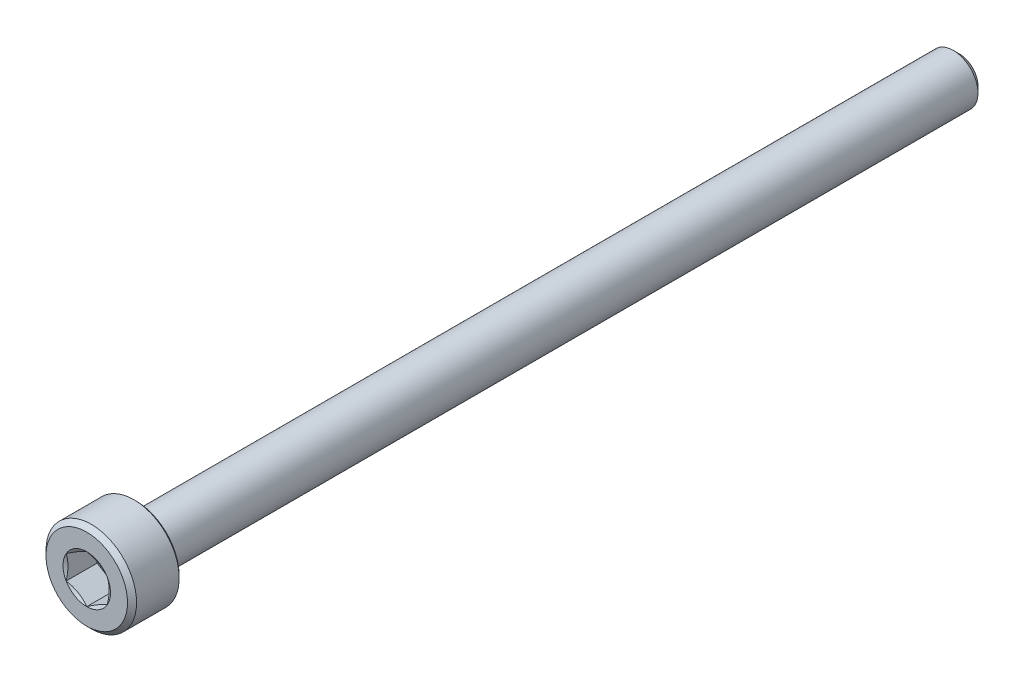
ISO-10303-21;
HEADER;
FILE_DESCRIPTION(('STEP AP214'),'2;1');
FILE_NAME('part.step','',(''),(''),'','','');
FILE_SCHEMA(('AUTOMOTIVE_DESIGN { 1 0 10303 214 1 1 1 1 }'));
ENDSEC;
DATA;
#1=APPLICATION_CONTEXT('core data for automotive mechanical design processes');
#2=APPLICATION_PROTOCOL_DEFINITION('international standard','automotive_design',2000,#1);
#3=PRODUCT_CONTEXT('',#1,'mechanical');
#4=PRODUCT('Part','Part','',(#3));
#5=PRODUCT_RELATED_PRODUCT_CATEGORY('part','',(#4));
#6=PRODUCT_DEFINITION_FORMATION('','',#4);
#7=PRODUCT_DEFINITION_CONTEXT('part definition',#1,'design');
#8=PRODUCT_DEFINITION('design','',#6,#7);
#9=PRODUCT_DEFINITION_SHAPE('','',#8);
#10=(LENGTH_UNIT() NAMED_UNIT(*) SI_UNIT(.MILLI.,.METRE.));
#11=(NAMED_UNIT(*) PLANE_ANGLE_UNIT() SI_UNIT($,.RADIAN.));
#12=(NAMED_UNIT(*) SI_UNIT($,.STERADIAN.) SOLID_ANGLE_UNIT());
#13=UNCERTAINTY_MEASURE_WITH_UNIT(LENGTH_MEASURE(1.E-05),#10,'distance_accuracy_value','');
#14=(GEOMETRIC_REPRESENTATION_CONTEXT(3) GLOBAL_UNCERTAINTY_ASSIGNED_CONTEXT((#13)) GLOBAL_UNIT_ASSIGNED_CONTEXT((#10,
#11,#12)) REPRESENTATION_CONTEXT('',''));
#15=CARTESIAN_POINT('',(0.,0.,0.));
#16=DIRECTION('',(0.,0.,1.));
#17=DIRECTION('',(1.,0.,0.));
#18=AXIS2_PLACEMENT_3D('',#15,#16,#17);
#19=CARTESIAN_POINT('',(-2.6125,0.,23.5));
#20=DIRECTION('',(0.,0.,-1.));
#21=DIRECTION('',(-1.,0.,0.));
#22=AXIS2_PLACEMENT_3D('',#19,#20,#21);
#23=PLANE('',#22);
#24=CARTESIAN_POINT('',(0.,0.,23.5));
#25=DIRECTION('',(0.,0.,-1.));
#26=DIRECTION('',(-1.,0.,0.));
#27=AXIS2_PLACEMENT_3D('',#24,#25,#26);
#28=CIRCLE('',#27,1.5);
#29=CARTESIAN_POINT('',(-1.5,0.,23.5));
#30=VERTEX_POINT('',#29);
#31=EDGE_CURVE('E12',#30,#30,#28,.T.);
#32=ORIENTED_EDGE('',*,*,#31,.F.);
#33=EDGE_LOOP('',(#32));
#34=FACE_BOUND('',#33,.T.);
#35=CARTESIAN_POINT('',(0.,0.,23.5));
#36=DIRECTION('',(0.,0.,-1.));
#37=DIRECTION('',(-1.,0.,0.));
#38=AXIS2_PLACEMENT_3D('',#35,#36,#37);
#39=CIRCLE('',#38,2.6125);
#40=CARTESIAN_POINT('',(-2.6125,0.,23.5));
#41=VERTEX_POINT('',#40);
#42=EDGE_CURVE('E260',#41,#41,#39,.T.);
#43=ORIENTED_EDGE('',*,*,#42,.T.);
#44=EDGE_LOOP('',(#43));
#45=FACE_BOUND('',#44,.T.);
#46=ADVANCED_FACE('F42',(#34,#45),#23,.T.);
#47=CARTESIAN_POINT('',(0.,0.,24.625));
#48=DIRECTION('',(0.,0.,1.));
#49=DIRECTION('',(1.,0.,0.));
#50=AXIS2_PLACEMENT_3D('',#47,#48,#49);
#51=PLANE('',#50);
#52=DIRECTION('',(-0.866025403784439,0.5,0.));
#53=VECTOR('',#52,1.);
#54=CARTESIAN_POINT('',(1.25,0.721687836487031,24.625));
#55=LINE('',#54,#53);
#56=CARTESIAN_POINT('',(1.25,0.721687836487031,24.625));
#57=VERTEX_POINT('',#56);
#58=CARTESIAN_POINT('',(0.,1.44337567297406,24.625));
#59=VERTEX_POINT('',#58);
#60=EDGE_CURVE('E108',#57,#59,#55,.T.);
#61=ORIENTED_EDGE('',*,*,#60,.T.);
#62=DIRECTION('',(-0.866025403784438,-0.5,0.));
#63=VECTOR('',#62,1.);
#64=CARTESIAN_POINT('',(0.,1.44337567297406,24.625));
#65=LINE('',#64,#63);
#66=CARTESIAN_POINT('',(-1.25,0.72168783648703,24.625));
#67=VERTEX_POINT('',#66);
#68=EDGE_CURVE('E227',#59,#67,#65,.T.);
#69=ORIENTED_EDGE('',*,*,#68,.T.);
#70=DIRECTION('',(0.,-1.,0.));
#71=VECTOR('',#70,1.);
#72=CARTESIAN_POINT('',(-1.25,0.72168783648703,24.625));
#73=LINE('',#72,#71);
#74=CARTESIAN_POINT('',(-1.25,-0.721687836487034,24.625));
#75=VERTEX_POINT('',#74);
#76=EDGE_CURVE('E230',#67,#75,#73,.T.);
#77=ORIENTED_EDGE('',*,*,#76,.T.);
#78=DIRECTION('',(0.866025403784439,-0.5,0.));
#79=VECTOR('',#78,1.);
#80=CARTESIAN_POINT('',(-1.25,-0.721687836487034,24.625));
#81=LINE('',#80,#79);
#82=CARTESIAN_POINT('',(0.,-1.44337567297407,24.625));
#83=VERTEX_POINT('',#82);
#84=EDGE_CURVE('E231',#75,#83,#81,.T.);
#85=ORIENTED_EDGE('',*,*,#84,.T.);
#86=DIRECTION('',(0.866025403784439,0.5,0.));
#87=VECTOR('',#86,1.);
#88=CARTESIAN_POINT('',(0.,-1.44337567297407,24.625));
#89=LINE('',#88,#87);
#90=CARTESIAN_POINT('',(1.25,-0.721687836487034,24.625));
#91=VERTEX_POINT('',#90);
#92=EDGE_CURVE('E236',#83,#91,#89,.T.);
#93=ORIENTED_EDGE('',*,*,#92,.T.);
#94=DIRECTION('',(0.,1.,0.));
#95=VECTOR('',#94,1.);
#96=CARTESIAN_POINT('',(1.25,-0.721687836487034,24.625));
#97=LINE('',#96,#95);
#98=EDGE_CURVE('E229',#91,#57,#97,.T.);
#99=ORIENTED_EDGE('',*,*,#98,.T.);
#100=EDGE_LOOP('',(#61,#69,#77,#85,#93,#99));
#101=FACE_BOUND('',#100,.T.);
#102=ADVANCED_FACE('F216',(#101),#51,.T.);
#103=CARTESIAN_POINT('',(0.,1.44337567297406,24.625));
#104=DIRECTION('',(-0.5,0.866025403784438,0.));
#105=DIRECTION('',(-0.866025403784439,-0.5,0.));
#106=AXIS2_PLACEMENT_3D('',#103,#104,#105);
#107=PLANE('',#106);
#108=DIRECTION('',(0.,0.,1.));
#109=VECTOR('',#108,1.);
#110=CARTESIAN_POINT('',(0.,1.44337567297406,24.625));
#111=LINE('',#110,#109);
#112=CARTESIAN_POINT('',(0.,1.44337567297406,26.5));
#113=VERTEX_POINT('',#112);
#114=EDGE_CURVE('E64',#59,#113,#111,.T.);
#115=ORIENTED_EDGE('',*,*,#114,.T.);
#116=CARTESIAN_POINT('',(0.000199999999999545,1.4434911430279,26.500066674666));
#117=CARTESIAN_POINT('',(-0.0547333052317655,1.41177538446486,26.4817459147637));
#118=CARTESIAN_POINT('',(-0.11014078650024,1.37978586023939,26.4650833062006));
#119=CARTESIAN_POINT('',(-0.22191536760034,1.31525277575269,26.4359973039458));
#120=CARTESIAN_POINT('',(-0.278284454841711,1.28270806805991,26.4235842019761));
#121=CARTESIAN_POINT('',(-0.390323974086985,1.21802202146378,26.404259687636));
#122=CARTESIAN_POINT('',(-0.44597715845923,1.1858906404852,26.3972196894474));
#123=CARTESIAN_POINT('',(-0.557545653908392,1.12147653960455,26.3888124326306));
#124=CARTESIAN_POINT('',(-0.613460558937601,1.08919405413422,26.3874382152047));
#125=CARTESIAN_POINT('',(-0.717957921181725,1.02886247391297,26.3902833373679));
#126=CARTESIAN_POINT('',(-0.766555949881316,1.00080438896118,26.39380409882));
#127=CARTESIAN_POINT('',(-0.863435362173239,0.944871034195501,26.4049671126993));
#128=CARTESIAN_POINT('',(-0.911716410192164,0.916995958125017,26.4126131855727));
#129=CARTESIAN_POINT('',(-1.00879588385404,0.860947097873544,26.4317294547005));
#130=CARTESIAN_POINT('',(-1.0575820103519,0.832780414607287,26.4432807569797));
#131=CARTESIAN_POINT('',(-1.1544262522921,0.776867365453646,26.4694983146939));
#132=CARTESIAN_POINT('',(-1.20248561032696,0.749120282155138,26.4841584021391));
#133=CARTESIAN_POINT('',(-1.2502,0.721572366433192,26.500066674666));
#134=B_SPLINE_CURVE_WITH_KNOTS('',3,(#116,#117,#118,#119,#120,#121,#122,#123,#124,#125,#126,
#127,#128,#129,#130,#131,#132,#133),.UNSPECIFIED.,.F.,.F.,(4,2,2,2,2,2,2,2,4),(0.,
0.198150821029559,0.396778196315221,0.5904886173544,0.783961049317182,0.952480056398646,
1.1211553973001,1.2935743034359,1.4656542697693),.UNSPECIFIED.);
#135=CARTESIAN_POINT('',(-1.25,0.721687836487032,26.5));
#136=VERTEX_POINT('',#135);
#137=EDGE_CURVE('E121',#113,#136,#134,.T.);
#138=ORIENTED_EDGE('',*,*,#137,.T.);
#139=DIRECTION('',(0.,0.,1.));
#140=VECTOR('',#139,1.);
#141=CARTESIAN_POINT('',(-1.25,0.72168783648703,24.625));
#142=LINE('',#141,#140);
#143=EDGE_CURVE('E245',#67,#136,#142,.T.);
#144=ORIENTED_EDGE('',*,*,#143,.F.);
#145=ORIENTED_EDGE('',*,*,#68,.F.);
#146=EDGE_LOOP('',(#115,#138,#144,#145));
#147=FACE_BOUND('',#146,.T.);
#148=ADVANCED_FACE('F155',(#147),#107,.F.);
#149=CARTESIAN_POINT('',(-1.25,0.72168783648703,24.625));
#150=DIRECTION('',(-1.,0.,0.));
#151=DIRECTION('',(0.,-1.,0.));
#152=AXIS2_PLACEMENT_3D('',#149,#150,#151);
#153=PLANE('',#152);
#154=ORIENTED_EDGE('',*,*,#143,.T.);
#155=CARTESIAN_POINT('',(-1.25,-1.86893140179217,26.9647941109243));
#156=CARTESIAN_POINT('',(-1.25,-1.81495202267025,26.9388968384665));
#157=CARTESIAN_POINT('',(-1.25,-1.76084125344196,26.9132686219312));
#158=CARTESIAN_POINT('',(-1.25,-1.65228662652066,26.8627027606134));
#159=CARTESIAN_POINT('',(-1.25,-1.59784271100767,26.8377652401103));
#160=CARTESIAN_POINT('',(-1.25,-1.48823931692675,26.7885939163498));
#161=CARTESIAN_POINT('',(-1.25,-1.43307750108907,26.7643652994868));
#162=CARTESIAN_POINT('',(-1.25,-1.32229188443621,26.7169950705039));
#163=CARTESIAN_POINT('',(-1.25,-1.26666810781962,26.6938534018645));
#164=CARTESIAN_POINT('',(-1.25,-1.15340083047608,26.6483546130678));
#165=CARTESIAN_POINT('',(-1.25,-1.09574254265115,26.6260338154653));
#166=CARTESIAN_POINT('',(-1.25,-0.979741082890175,26.583255476912));
#167=CARTESIAN_POINT('',(-1.25,-0.921397826164638,26.5627981694397));
#168=CARTESIAN_POINT('',(-1.25,-0.745435524772241,26.5050842376762));
#169=CARTESIAN_POINT('',(-1.25,-0.62656193813286,26.4713502149769));
#170=CARTESIAN_POINT('',(-1.25,-0.445873083681239,26.4322204068282));
#171=CARTESIAN_POINT('',(-1.25,-0.385304700192768,26.4210940606189));
#172=CARTESIAN_POINT('',(-1.25,-0.26348659206503,26.4034278522676));
#173=CARTESIAN_POINT('',(-1.25,-0.202236913753247,26.3968876801832));
#174=CARTESIAN_POINT('',(-1.25,-0.0801324468775848,26.3889987810428));
#175=CARTESIAN_POINT('',(-1.25,-0.0192817197887167,26.3875887912582));
#176=CARTESIAN_POINT('',(-1.25,0.102319232701152,26.3899161878862));
#177=CARTESIAN_POINT('',(-1.25,0.163069451645859,26.393653893026));
#178=CARTESIAN_POINT('',(-1.25,0.312961598922923,26.4088980280361));
#179=CARTESIAN_POINT('',(-1.25,0.401813055628259,26.4232612484297));
#180=CARTESIAN_POINT('',(-1.25,0.577788146583198,26.4602998495149));
#181=CARTESIAN_POINT('',(-1.25,0.664909564430747,26.4829852483542));
#182=CARTESIAN_POINT('',(-1.25,0.795209224728791,26.5217374532821));
#183=CARTESIAN_POINT('',(-1.25,0.839061001813533,26.5356229448103));
#184=CARTESIAN_POINT('',(-1.25,0.926308087473953,26.5646784153621));
#185=CARTESIAN_POINT('',(-1.25,0.969703662172459,26.5798475927664));
#186=CARTESIAN_POINT('',(-1.25,1.05609633508794,26.6112501339966));
#187=CARTESIAN_POINT('',(-1.25,1.09909350410933,26.627483304423));
#188=CARTESIAN_POINT('',(-1.25,1.18474903910479,26.6608382439108));
#189=CARTESIAN_POINT('',(-1.25,1.22740734642399,26.6779601631043));
#190=CARTESIAN_POINT('',(-1.25,1.33629459550825,26.7227614292321));
#191=CARTESIAN_POINT('',(-1.25,1.40230581092028,26.7509693835735));
#192=CARTESIAN_POINT('',(-1.25,1.53373213594212,26.8087450811585));
#193=CARTESIAN_POINT('',(-1.25,1.59914720045374,26.8383129262699));
#194=CARTESIAN_POINT('',(-1.25,1.79469680395942,26.9285769200244));
#195=CARTESIAN_POINT('',(-1.25,1.92411390982368,26.9908242731852));
#196=CARTESIAN_POINT('',(-1.25,2.18184246876936,27.1179296229027));
#197=CARTESIAN_POINT('',(-1.25,2.31015236703661,27.182790734765));
#198=CARTESIAN_POINT('',(-1.25,2.56589305685455,27.3141807455314));
#199=CARTESIAN_POINT('',(-1.25,2.69332395754888,27.3807094324427));
#200=CARTESIAN_POINT('',(-1.25,2.93557826301822,27.5085820016458));
#201=CARTESIAN_POINT('',(-1.25,3.05045639113076,27.5698225704122));
#202=CARTESIAN_POINT('',(-1.25,3.27984311898855,27.6930014800409));
#203=CARTESIAN_POINT('',(-1.25,3.39435170485538,27.7549398467261));
#204=CARTESIAN_POINT('',(-1.25,3.62279327872168,27.8791811560561));
#205=CARTESIAN_POINT('',(-1.25,3.73672698995313,27.941482770676));
#206=CARTESIAN_POINT('',(-1.25,3.96436406629495,28.0664914919315));
#207=CARTESIAN_POINT('',(-1.25,4.07806744314788,28.1291985771761));
#208=CARTESIAN_POINT('',(-1.25,4.19168806612954,28.1920543493623));
#209=B_SPLINE_CURVE_WITH_KNOTS('',3,(#155,#156,#157,#158,#159,#160,#161,#162,#163,#164,#165,
#166,#167,#168,#169,#170,#171,#172,#173,#174,#175,#176,#177,#178,#179,#180,#181,#182,#183,#184,
#185,#186,#187,#188,#189,#190,#191,#192,#193,#194,#195,#196,#197,#198,#199,#200,#201,#202,#203,
#204,#205,#206,#207,#208),.UNSPECIFIED.,.F.,.F.,(4,2,2,2,2,2,2,2,2,2,2,2,2,2,2,2,2,2,2,2,2,2,2,
2,2,2,4),(0.,0.179612926712514,0.359257964580623,0.539992735616907,0.720718098311213,
0.906167781883877,1.09164066876278,1.4615401462125,1.64614554413147,1.83073846485712,
2.0131196740194,2.19551217609307,2.46497297688035,2.73475922178117,2.87273702323329,
3.01062928909397,3.14849655975686,3.28638719597089,3.50172172546908,3.7170724117864,
4.14784491349865,4.57914698286382,5.01039449766869,5.40093821140478,5.79149642546539,
6.18106124184771,6.57060567131893),.UNSPECIFIED.);
#210=CARTESIAN_POINT('',(-1.25,-0.721687836487033,26.5));
#211=VERTEX_POINT('',#210);
#212=EDGE_CURVE('E128',#136,#211,#209,.F.);
#213=ORIENTED_EDGE('',*,*,#212,.T.);
#214=DIRECTION('',(0.,0.,1.));
#215=VECTOR('',#214,1.);
#216=CARTESIAN_POINT('',(-1.25,-0.721687836487034,24.625));
#217=LINE('',#216,#215);
#218=EDGE_CURVE('E243',#75,#211,#217,.T.);
#219=ORIENTED_EDGE('',*,*,#218,.F.);
#220=ORIENTED_EDGE('',*,*,#76,.F.);
#221=EDGE_LOOP('',(#154,#213,#219,#220));
#222=FACE_BOUND('',#221,.T.);
#223=ADVANCED_FACE('F150',(#222),#153,.F.);
#224=CARTESIAN_POINT('',(-1.25,-0.721687836487034,24.625));
#225=DIRECTION('',(-0.5,-0.866025403784439,0.));
#226=DIRECTION('',(0.866025403784439,-0.5,0.));
#227=AXIS2_PLACEMENT_3D('',#224,#225,#226);
#228=PLANE('',#227);
#229=ORIENTED_EDGE('',*,*,#218,.T.);
#230=CARTESIAN_POINT('',(-1.2502,-0.721572366433196,26.500066674666));
#231=CARTESIAN_POINT('',(-1.19526669476823,-0.753288124996232,26.4817459147637));
#232=CARTESIAN_POINT('',(-1.13985921349976,-0.785277649221705,26.4650833062006));
#233=CARTESIAN_POINT('',(-1.02808463239966,-0.849810733708405,26.4359973039458));
#234=CARTESIAN_POINT('',(-0.971715545158289,-0.882355441401184,26.4235842019761));
#235=CARTESIAN_POINT('',(-0.859676025913015,-0.94704148799732,26.404259687636));
#236=CARTESIAN_POINT('',(-0.804022841540769,-0.979172868975895,26.3972196894474));
#237=CARTESIAN_POINT('',(-0.692454346091607,-1.04358696985655,26.3888124326306));
#238=CARTESIAN_POINT('',(-0.636539441062399,-1.07586945532688,26.3874382152047));
#239=CARTESIAN_POINT('',(-0.532042078818274,-1.13620103554813,26.3902833373679));
#240=CARTESIAN_POINT('',(-0.483444050118683,-1.16425912049992,26.39380409882));
#241=CARTESIAN_POINT('',(-0.38656463782676,-1.2201924752656,26.4049671126993));
#242=CARTESIAN_POINT('',(-0.338283589807835,-1.24806755133608,26.4126131855727));
#243=CARTESIAN_POINT('',(-0.241204116145956,-1.30411641158755,26.4317294547005));
#244=CARTESIAN_POINT('',(-0.192417989648099,-1.33228309485381,26.4432807569797));
#245=CARTESIAN_POINT('',(-0.0955737477078969,-1.38819614400745,26.4694983146939));
#246=CARTESIAN_POINT('',(-0.0475143896730349,-1.41594322730596,26.4841584021391));
#247=CARTESIAN_POINT('',(0.000200000000000781,-1.4434911430279,26.500066674666));
#248=B_SPLINE_CURVE_WITH_KNOTS('',3,(#230,#231,#232,#233,#234,#235,#236,#237,#238,#239,#240,
#241,#242,#243,#244,#245,#246,#247),.UNSPECIFIED.,.F.,.F.,(4,2,2,2,2,2,2,2,4),(0.,
0.198150821029561,0.396778196315222,0.590488617354401,0.783961049317183,0.952480056398648,
1.1211553973001,1.2935743034359,1.4656542697693),.UNSPECIFIED.);
#249=CARTESIAN_POINT('',(0.,-1.44337567297407,26.5));
#250=VERTEX_POINT('',#249);
#251=EDGE_CURVE('E131',#211,#250,#248,.T.);
#252=ORIENTED_EDGE('',*,*,#251,.T.);
#253=DIRECTION('',(0.,0.,1.));
#254=VECTOR('',#253,1.);
#255=CARTESIAN_POINT('',(0.,-1.44337567297407,24.625));
#256=LINE('',#255,#254);
#257=EDGE_CURVE('E240',#83,#250,#256,.T.);
#258=ORIENTED_EDGE('',*,*,#257,.F.);
#259=ORIENTED_EDGE('',*,*,#84,.F.);
#260=EDGE_LOOP('',(#229,#252,#258,#259));
#261=FACE_BOUND('',#260,.T.);
#262=ADVANCED_FACE('F154',(#261),#228,.F.);
#263=CARTESIAN_POINT('',(0.,-1.44337567297407,24.625));
#264=DIRECTION('',(0.5,-0.866025403784439,0.));
#265=DIRECTION('',(0.866025403784439,0.5,0.));
#266=AXIS2_PLACEMENT_3D('',#263,#264,#265);
#267=PLANE('',#266);
#268=ORIENTED_EDGE('',*,*,#257,.T.);
#269=CARTESIAN_POINT('',(-0.000199999999999969,-1.4434911430279,26.500066674666));
#270=CARTESIAN_POINT('',(0.0547333052317651,-1.41177538446487,26.4817459147637));
#271=CARTESIAN_POINT('',(0.11014078650024,-1.3797858602394,26.4650833062006));
#272=CARTESIAN_POINT('',(0.22191536760034,-1.3152527757527,26.4359973039458));
#273=CARTESIAN_POINT('',(0.278284454841711,-1.28270806805992,26.4235842019761));
#274=CARTESIAN_POINT('',(0.390323974086985,-1.21802202146378,26.404259687636));
#275=CARTESIAN_POINT('',(0.44597715845923,-1.18589064048521,26.3972196894474));
#276=CARTESIAN_POINT('',(0.557545653908392,-1.12147653960455,26.3888124326306));
#277=CARTESIAN_POINT('',(0.613460558937601,-1.08919405413422,26.3874382152047));
#278=CARTESIAN_POINT('',(0.717957921181726,-1.02886247391297,26.3902833373679));
#279=CARTESIAN_POINT('',(0.766555949881316,-1.00080438896118,26.39380409882));
#280=CARTESIAN_POINT('',(0.863435362173239,-0.944871034195505,26.4049671126993));
#281=CARTESIAN_POINT('',(0.911716410192163,-0.916995958125021,26.4126131855727));
#282=CARTESIAN_POINT('',(1.00879588385404,-0.860947097873548,26.4317294547005));
#283=CARTESIAN_POINT('',(1.0575820103519,-0.832780414607291,26.4432807569797));
#284=CARTESIAN_POINT('',(1.1544262522921,-0.77686736545365,26.4694983146939));
#285=CARTESIAN_POINT('',(1.20248561032696,-0.749120282155142,26.4841584021391));
#286=CARTESIAN_POINT('',(1.2502,-0.721572366433196,26.500066674666));
#287=B_SPLINE_CURVE_WITH_KNOTS('',3,(#269,#270,#271,#272,#273,#274,#275,#276,#277,#278,#279,
#280,#281,#282,#283,#284,#285,#286),.UNSPECIFIED.,.F.,.F.,(4,2,2,2,2,2,2,2,4),(0.,
0.19815082102956,0.396778196315222,0.590488617354401,0.783961049317183,0.952480056398647,
1.1211553973001,1.2935743034359,1.4656542697693),.UNSPECIFIED.);
#288=CARTESIAN_POINT('',(1.25,-0.721687836487034,26.5));
#289=VERTEX_POINT('',#288);
#290=EDGE_CURVE('E116',#250,#289,#287,.T.);
#291=ORIENTED_EDGE('',*,*,#290,.T.);
#292=DIRECTION('',(0.,0.,1.));
#293=VECTOR('',#292,1.);
#294=CARTESIAN_POINT('',(1.25,-0.721687836487034,24.625));
#295=LINE('',#294,#293);
#296=EDGE_CURVE('E114',#91,#289,#295,.T.);
#297=ORIENTED_EDGE('',*,*,#296,.F.);
#298=ORIENTED_EDGE('',*,*,#92,.F.);
#299=EDGE_LOOP('',(#268,#291,#297,#298));
#300=FACE_BOUND('',#299,.T.);
#301=ADVANCED_FACE('F161',(#300),#267,.F.);
#302=CARTESIAN_POINT('',(1.25,-0.721687836487034,24.625));
#303=DIRECTION('',(1.,0.,0.));
#304=DIRECTION('',(0.,0.,-1.));
#305=AXIS2_PLACEMENT_3D('',#302,#303,#304);
#306=PLANE('',#305);
#307=ORIENTED_EDGE('',*,*,#296,.T.);
#308=CARTESIAN_POINT('',(1.25,-1.86893140179217,26.9647941109243));
#309=CARTESIAN_POINT('',(1.25,-1.81495202267025,26.9388968384665));
#310=CARTESIAN_POINT('',(1.25,-1.76084125344196,26.9132686219312));
#311=CARTESIAN_POINT('',(1.25,-1.65228662652066,26.8627027606134));
#312=CARTESIAN_POINT('',(1.25,-1.59784271100767,26.8377652401103));
#313=CARTESIAN_POINT('',(1.25,-1.48823931692675,26.7885939163498));
#314=CARTESIAN_POINT('',(1.25,-1.43307750108907,26.7643652994868));
#315=CARTESIAN_POINT('',(1.25,-1.32229188443621,26.7169950705039));
#316=CARTESIAN_POINT('',(1.25,-1.26666810781962,26.6938534018645));
#317=CARTESIAN_POINT('',(1.25,-1.15340083047608,26.6483546130678));
#318=CARTESIAN_POINT('',(1.25,-1.09574254265115,26.6260338154653));
#319=CARTESIAN_POINT('',(1.25,-0.979741082890175,26.583255476912));
#320=CARTESIAN_POINT('',(1.25,-0.921397826164639,26.5627981694397));
#321=CARTESIAN_POINT('',(1.25,-0.745435524772241,26.5050842376762));
#322=CARTESIAN_POINT('',(1.25,-0.626561938132861,26.4713502149769));
#323=CARTESIAN_POINT('',(1.25,-0.445873083681239,26.4322204068282));
#324=CARTESIAN_POINT('',(1.25,-0.385304700192768,26.4210940606189));
#325=CARTESIAN_POINT('',(1.25,-0.26348659206503,26.4034278522676));
#326=CARTESIAN_POINT('',(1.25,-0.202236913753247,26.3968876801832));
#327=CARTESIAN_POINT('',(1.25,-0.0801324468775847,26.3889987810428));
#328=CARTESIAN_POINT('',(1.25,-0.0192817197887163,26.3875887912582));
#329=CARTESIAN_POINT('',(1.25,0.102319232701152,26.3899161878862));
#330=CARTESIAN_POINT('',(1.25,0.16306945164586,26.393653893026));
#331=CARTESIAN_POINT('',(1.25,0.312961598922924,26.4088980280361));
#332=CARTESIAN_POINT('',(1.25,0.40181305562826,26.4232612484297));
#333=CARTESIAN_POINT('',(1.25,0.577788146583198,26.4602998495149));
#334=CARTESIAN_POINT('',(1.25,0.664909564430748,26.4829852483542));
#335=CARTESIAN_POINT('',(1.25,0.795209224728792,26.5217374532821));
#336=CARTESIAN_POINT('',(1.25,0.839061001813534,26.5356229448103));
#337=CARTESIAN_POINT('',(1.25,0.926308087473953,26.5646784153621));
#338=CARTESIAN_POINT('',(1.25,0.96970366217246,26.5798475927664));
#339=CARTESIAN_POINT('',(1.25,1.05609633508794,26.6112501339966));
#340=CARTESIAN_POINT('',(1.25,1.09909350410933,26.627483304423));
#341=CARTESIAN_POINT('',(1.25,1.1847490391048,26.6608382439108));
#342=CARTESIAN_POINT('',(1.25,1.22740734642399,26.6779601631043));
#343=CARTESIAN_POINT('',(1.25,1.33629459550825,26.7227614292321));
#344=CARTESIAN_POINT('',(1.25,1.40230581092028,26.7509693835735));
#345=CARTESIAN_POINT('',(1.25,1.53373213594212,26.8087450811585));
#346=CARTESIAN_POINT('',(1.25,1.59914720045374,26.8383129262699));
#347=CARTESIAN_POINT('',(1.25,1.79469680395942,26.9285769200244));
#348=CARTESIAN_POINT('',(1.25,1.92411390982368,26.9908242731852));
#349=CARTESIAN_POINT('',(1.25,2.18184246876936,27.1179296229027));
#350=CARTESIAN_POINT('',(1.25,2.31015236703661,27.182790734765));
#351=CARTESIAN_POINT('',(1.25,2.56589305685455,27.3141807455314));
#352=CARTESIAN_POINT('',(1.25,2.69332395754888,27.3807094324427));
#353=CARTESIAN_POINT('',(1.25,2.93557826301822,27.5085820016458));
#354=CARTESIAN_POINT('',(1.25,3.05045639113076,27.5698225704122));
#355=CARTESIAN_POINT('',(1.25,3.27984311898855,27.6930014800409));
#356=CARTESIAN_POINT('',(1.25,3.39435170485538,27.7549398467262));
#357=CARTESIAN_POINT('',(1.25,3.62279327872168,27.8791811560561));
#358=CARTESIAN_POINT('',(1.25,3.73672698995313,27.941482770676));
#359=CARTESIAN_POINT('',(1.25,3.96436406629495,28.0664914919315));
#360=CARTESIAN_POINT('',(1.25,4.07806744314788,28.1291985771761));
#361=CARTESIAN_POINT('',(1.25,4.19168806612954,28.1920543493623));
#362=B_SPLINE_CURVE_WITH_KNOTS('',3,(#308,#309,#310,#311,#312,#313,#314,#315,#316,#317,#318,
#319,#320,#321,#322,#323,#324,#325,#326,#327,#328,#329,#330,#331,#332,#333,#334,#335,#336,#337,
#338,#339,#340,#341,#342,#343,#344,#345,#346,#347,#348,#349,#350,#351,#352,#353,#354,#355,#356,
#357,#358,#359,#360,#361),.UNSPECIFIED.,.F.,.F.,(4,2,2,2,2,2,2,2,2,2,2,2,2,2,2,2,2,2,2,2,2,2,2,
2,2,2,4),(0.,0.179612926712516,0.359257964580625,0.539992735616909,0.720718098311215,
0.906167781883879,1.09164066876279,1.4615401462125,1.64614554413147,1.83073846485713,
2.01311967401941,2.19551217609307,2.46497297688035,2.73475922178117,2.87273702323329,
3.01062928909397,3.14849655975687,3.28638719597089,3.50172172546908,3.7170724117864,
4.14784491349865,4.57914698286382,5.01039449766869,5.40093821140478,5.79149642546539,
6.18106124184772,6.57060567131893),.UNSPECIFIED.);
#363=CARTESIAN_POINT('',(1.25,0.721687836487028,26.5));
#364=VERTEX_POINT('',#363);
#365=EDGE_CURVE('E100',#289,#364,#362,.T.);
#366=ORIENTED_EDGE('',*,*,#365,.T.);
#367=DIRECTION('',(0.,0.,1.));
#368=VECTOR('',#367,1.);
#369=CARTESIAN_POINT('',(1.25,0.721687836487031,24.625));
#370=LINE('',#369,#368);
#371=EDGE_CURVE('E113',#57,#364,#370,.T.);
#372=ORIENTED_EDGE('',*,*,#371,.F.);
#373=ORIENTED_EDGE('',*,*,#98,.F.);
#374=EDGE_LOOP('',(#307,#366,#372,#373));
#375=FACE_BOUND('',#374,.T.);
#376=ADVANCED_FACE('F111',(#375),#306,.F.);
#377=CARTESIAN_POINT('',(1.25,0.721687836487031,24.625));
#378=DIRECTION('',(0.5,0.866025403784439,0.));
#379=DIRECTION('',(-0.866025403784439,0.5,0.));
#380=AXIS2_PLACEMENT_3D('',#377,#378,#379);
#381=PLANE('',#380);
#382=ORIENTED_EDGE('',*,*,#371,.T.);
#383=CARTESIAN_POINT('',(1.2502,0.721572366433193,26.500066674666));
#384=CARTESIAN_POINT('',(1.19526669476823,0.753288124996229,26.4817459147637));
#385=CARTESIAN_POINT('',(1.13985921349976,0.785277649221701,26.4650833062006));
#386=CARTESIAN_POINT('',(1.02808463239966,0.849810733708402,26.4359973039458));
#387=CARTESIAN_POINT('',(0.97171554515829,0.88235544140118,26.4235842019761));
#388=CARTESIAN_POINT('',(0.859676025913015,0.947041487997316,26.404259687636));
#389=CARTESIAN_POINT('',(0.80402284154077,0.979172868975891,26.3972196894474));
#390=CARTESIAN_POINT('',(0.692454346091608,1.04358696985655,26.3888124326306));
#391=CARTESIAN_POINT('',(0.636539441062399,1.07586945532687,26.3874382152047));
#392=CARTESIAN_POINT('',(0.532042078818275,1.13620103554812,26.3902833373679));
#393=CARTESIAN_POINT('',(0.483444050118684,1.16425912049992,26.39380409882));
#394=CARTESIAN_POINT('',(0.386564637826761,1.22019247526559,26.4049671126993));
#395=CARTESIAN_POINT('',(0.338283589807836,1.24806755133608,26.4126131855727));
#396=CARTESIAN_POINT('',(0.241204116145956,1.30411641158755,26.4317294547005));
#397=CARTESIAN_POINT('',(0.1924179896481,1.33228309485381,26.4432807569797));
#398=CARTESIAN_POINT('',(0.0955737477078973,1.38819614400745,26.4694983146939));
#399=CARTESIAN_POINT('',(0.0475143896730352,1.41594322730595,26.4841584021391));
#400=CARTESIAN_POINT('',(-0.00020000000000046,1.4434911430279,26.500066674666));
#401=B_SPLINE_CURVE_WITH_KNOTS('',3,(#383,#384,#385,#386,#387,#388,#389,#390,#391,#392,#393,
#394,#395,#396,#397,#398,#399,#400),.UNSPECIFIED.,.F.,.F.,(4,2,2,2,2,2,2,2,4),(0.,
0.198150821029558,0.39677819631522,0.590488617354399,0.783961049317182,0.952480056398646,
1.1211553973001,1.2935743034359,1.4656542697693),.UNSPECIFIED.);
#402=EDGE_CURVE('E105',#364,#113,#401,.T.);
#403=ORIENTED_EDGE('',*,*,#402,.T.);
#404=ORIENTED_EDGE('',*,*,#114,.F.);
#405=ORIENTED_EDGE('',*,*,#60,.F.);
#406=EDGE_LOOP('',(#382,#403,#404,#405));
#407=FACE_BOUND('',#406,.T.);
#408=ADVANCED_FACE('F118',(#407),#381,.F.);
#409=CARTESIAN_POINT('',(0.,0.,26.5));
#410=DIRECTION('',(0.,0.,1.));
#411=DIRECTION('',(1.,0.,0.));
#412=AXIS2_PLACEMENT_3D('',#409,#410,#411);
#413=CONICAL_SURFACE('',#412,1.44337567297406,1.0471975511966);
#414=CARTESIAN_POINT('',(0.,0.,26.5));
#415=DIRECTION('',(0.,0.,1.));
#416=DIRECTION('',(1.,0.,0.));
#417=AXIS2_PLACEMENT_3D('',#414,#415,#416);
#418=CIRCLE('',#417,1.44337567297406);
#419=EDGE_CURVE('E127',#113,#136,#418,.T.);
#420=ORIENTED_EDGE('',*,*,#419,.T.);
#421=ORIENTED_EDGE('',*,*,#137,.F.);
#422=EDGE_LOOP('',(#420,#421));
#423=FACE_BOUND('',#422,.T.);
#424=ADVANCED_FACE('F185',(#423),#413,.F.);
#425=EDGE_CURVE('E129',#136,#211,#418,.T.);
#426=ORIENTED_EDGE('',*,*,#425,.T.);
#427=ORIENTED_EDGE('',*,*,#212,.F.);
#428=EDGE_LOOP('',(#426,#427));
#429=FACE_BOUND('',#428,.T.);
#430=ADVANCED_FACE('F296',(#429),#413,.F.);
#431=EDGE_CURVE('E285',#211,#250,#418,.T.);
#432=ORIENTED_EDGE('',*,*,#431,.T.);
#433=ORIENTED_EDGE('',*,*,#251,.F.);
#434=EDGE_LOOP('',(#432,#433));
#435=FACE_BOUND('',#434,.T.);
#436=ADVANCED_FACE('F294',(#435),#413,.F.);
#437=EDGE_CURVE('E104',#250,#289,#418,.T.);
#438=ORIENTED_EDGE('',*,*,#437,.T.);
#439=ORIENTED_EDGE('',*,*,#290,.F.);
#440=EDGE_LOOP('',(#438,#439));
#441=FACE_BOUND('',#440,.T.);
#442=ADVANCED_FACE('F291',(#441),#413,.F.);
#443=EDGE_CURVE('E50',#289,#364,#418,.T.);
#444=ORIENTED_EDGE('',*,*,#443,.T.);
#445=ORIENTED_EDGE('',*,*,#365,.F.);
#446=EDGE_LOOP('',(#444,#445));
#447=FACE_BOUND('',#446,.T.);
#448=ADVANCED_FACE('F98',(#447),#413,.F.);
#449=EDGE_CURVE('E45',#364,#113,#418,.T.);
#450=ORIENTED_EDGE('',*,*,#449,.T.);
#451=ORIENTED_EDGE('',*,*,#402,.F.);
#452=EDGE_LOOP('',(#450,#451));
#453=FACE_BOUND('',#452,.T.);
#454=ADVANCED_FACE('F106',(#453),#413,.F.);
#455=CARTESIAN_POINT('',(0.,2.74999999999999,26.5));
#456=DIRECTION('',(0.,0.,1.));
#457=DIRECTION('',(1.,0.,0.));
#458=AXIS2_PLACEMENT_3D('',#455,#456,#457);
#459=PLANE('',#458);
#460=CARTESIAN_POINT('',(0.,0.,26.5));
#461=DIRECTION('',(0.,0.,1.));
#462=DIRECTION('',(1.,0.,0.));
#463=AXIS2_PLACEMENT_3D('',#460,#461,#462);
#464=CIRCLE('',#463,2.475);
#465=CARTESIAN_POINT('',(2.475,0.,26.5));
#466=VERTEX_POINT('',#465);
#467=EDGE_CURVE('E257',#466,#466,#464,.T.);
#468=ORIENTED_EDGE('',*,*,#467,.T.);
#469=EDGE_LOOP('',(#468));
#470=FACE_BOUND('',#469,.T.);
#471=ORIENTED_EDGE('',*,*,#449,.F.);
#472=ORIENTED_EDGE('',*,*,#443,.F.);
#473=ORIENTED_EDGE('',*,*,#437,.F.);
#474=ORIENTED_EDGE('',*,*,#431,.F.);
#475=ORIENTED_EDGE('',*,*,#425,.F.);
#476=ORIENTED_EDGE('',*,*,#419,.F.);
#477=EDGE_LOOP('',(#471,#472,#473,#474,#475,#476));
#478=FACE_BOUND('',#477,.T.);
#479=ADVANCED_FACE('F124',(#470,#478),#459,.T.);
#480=CARTESIAN_POINT('',(0.,0.,26.225));
#481=DIRECTION('',(0.,0.,-1.));
#482=DIRECTION('',(-1.,0.,0.));
#483=AXIS2_PLACEMENT_3D('',#480,#481,#482);
#484=CONICAL_SURFACE('',#483,2.75,0.785398163397463);
#485=ORIENTED_EDGE('',*,*,#467,.F.);
#486=EDGE_LOOP('',(#485));
#487=FACE_BOUND('',#486,.T.);
#488=CARTESIAN_POINT('',(0.,0.,26.225));
#489=DIRECTION('',(0.,0.,1.));
#490=DIRECTION('',(1.,0.,0.));
#491=AXIS2_PLACEMENT_3D('',#488,#489,#490);
#492=CIRCLE('',#491,2.75);
#493=CARTESIAN_POINT('',(2.75,0.,26.225));
#494=VERTEX_POINT('',#493);
#495=EDGE_CURVE('E254',#494,#494,#492,.F.);
#496=ORIENTED_EDGE('',*,*,#495,.F.);
#497=EDGE_LOOP('',(#496));
#498=FACE_BOUND('',#497,.T.);
#499=ADVANCED_FACE('F190',(#487,#498),#484,.T.);
#500=CARTESIAN_POINT('',(0.,0.,-26.5));
#501=DIRECTION('',(0.,0.,-1.));
#502=DIRECTION('',(-1.,0.,0.));
#503=AXIS2_PLACEMENT_3D('',#500,#501,#502);
#504=CYLINDRICAL_SURFACE('',#503,2.75);
#505=CARTESIAN_POINT('',(0.,0.,23.6375));
#506=DIRECTION('',(0.,0.,-1.));
#507=DIRECTION('',(-1.,0.,0.));
#508=AXIS2_PLACEMENT_3D('',#505,#506,#507);
#509=CIRCLE('',#508,2.75);
#510=CARTESIAN_POINT('',(-2.75,0.,23.6375));
#511=VERTEX_POINT('',#510);
#512=EDGE_CURVE('E263',#511,#511,#509,.F.);
#513=ORIENTED_EDGE('',*,*,#512,.T.);
#514=EDGE_LOOP('',(#513));
#515=FACE_BOUND('',#514,.T.);
#516=ORIENTED_EDGE('',*,*,#495,.T.);
#517=EDGE_LOOP('',(#516));
#518=FACE_BOUND('',#517,.T.);
#519=ADVANCED_FACE('F186',(#515,#518),#504,.T.);
#520=CARTESIAN_POINT('',(0.,0.,23.5));
#521=DIRECTION('',(0.,0.,1.));
#522=DIRECTION('',(1.,0.,0.));
#523=AXIS2_PLACEMENT_3D('',#520,#521,#522);
#524=CONICAL_SURFACE('',#523,2.6125,0.785398163397453);
#525=ORIENTED_EDGE('',*,*,#512,.F.);
#526=EDGE_LOOP('',(#525));
#527=FACE_BOUND('',#526,.T.);
#528=ORIENTED_EDGE('',*,*,#42,.F.);
#529=EDGE_LOOP('',(#528));
#530=FACE_BOUND('',#529,.T.);
#531=ADVANCED_FACE('F189',(#527,#530),#524,.T.);
#532=CARTESIAN_POINT('',(0.,0.,-26.5));
#533=DIRECTION('',(0.,0.,-1.));
#534=DIRECTION('',(-1.,0.,0.));
#535=AXIS2_PLACEMENT_3D('',#532,#533,#534);
#536=CYLINDRICAL_SURFACE('',#535,1.5);
#537=CARTESIAN_POINT('',(0.,0.,-26.125));
#538=DIRECTION('',(0.,0.,-1.));
#539=DIRECTION('',(-1.,0.,0.));
#540=AXIS2_PLACEMENT_3D('',#537,#538,#539);
#541=CIRCLE('',#540,1.5);
#542=CARTESIAN_POINT('',(-1.5,0.,-26.125));
#543=VERTEX_POINT('',#542);
#544=EDGE_CURVE('E269',#543,#543,#541,.T.);
#545=ORIENTED_EDGE('',*,*,#544,.F.);
#546=EDGE_LOOP('',(#545));
#547=FACE_BOUND('',#546,.T.);
#548=ORIENTED_EDGE('',*,*,#31,.T.);
#549=EDGE_LOOP('',(#548));
#550=FACE_BOUND('',#549,.T.);
#551=ADVANCED_FACE('F200',(#547,#550),#536,.T.);
#552=CARTESIAN_POINT('',(0.,0.,-26.125));
#553=DIRECTION('',(0.,0.,1.));
#554=DIRECTION('',(1.,0.,0.));
#555=AXIS2_PLACEMENT_3D('',#552,#553,#554);
#556=CONICAL_SURFACE('',#555,1.5,0.785398163397448);
#557=CARTESIAN_POINT('',(0.,0.,-26.5));
#558=DIRECTION('',(0.,0.,-1.));
#559=DIRECTION('',(-1.,0.,0.));
#560=AXIS2_PLACEMENT_3D('',#557,#558,#559);
#561=CIRCLE('',#560,1.125);
#562=CARTESIAN_POINT('',(-1.125,0.,-26.5));
#563=VERTEX_POINT('',#562);
#564=EDGE_CURVE('E265',#563,#563,#561,.T.);
#565=ORIENTED_EDGE('',*,*,#564,.F.);
#566=EDGE_LOOP('',(#565));
#567=FACE_BOUND('',#566,.T.);
#568=ORIENTED_EDGE('',*,*,#544,.T.);
#569=EDGE_LOOP('',(#568));
#570=FACE_BOUND('',#569,.T.);
#571=ADVANCED_FACE('F204',(#567,#570),#556,.T.);
#572=CARTESIAN_POINT('',(0.,1.49999999999999,-26.5));
#573=DIRECTION('',(0.,0.,-1.));
#574=DIRECTION('',(-1.,0.,0.));
#575=AXIS2_PLACEMENT_3D('',#572,#573,#574);
#576=PLANE('',#575);
#577=ORIENTED_EDGE('',*,*,#564,.T.);
#578=EDGE_LOOP('',(#577));
#579=FACE_BOUND('',#578,.T.);
#580=ADVANCED_FACE('F206',(#579),#576,.T.);
#581=CLOSED_SHELL('',(#46,#102,#148,#223,#262,#301,#376,#408,#424,#430,#436,#442,#448,#454,#479,
#499,#519,#531,#551,#571,#580));
#582=MANIFOLD_SOLID_BREP('B2',#581);
#583=ADVANCED_BREP_SHAPE_REPRESENTATION('',(#18,#582),#14);
#584=SHAPE_DEFINITION_REPRESENTATION(#9,#583);
ENDSEC;
END-ISO-10303-21;
